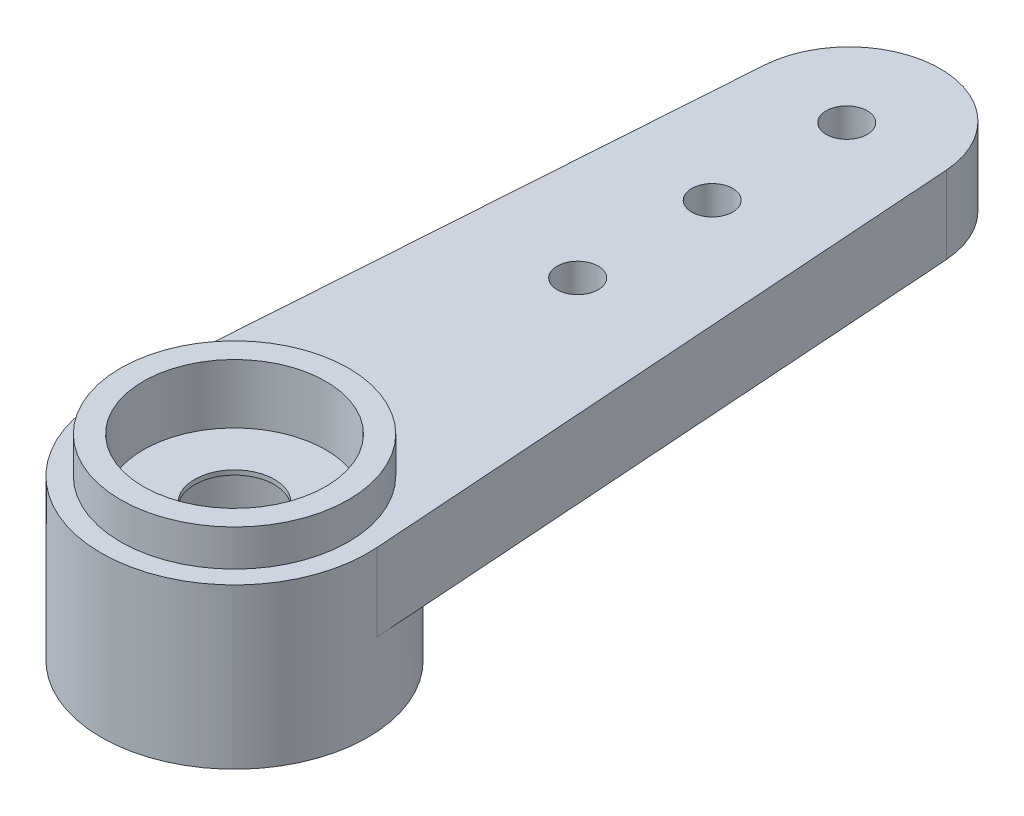
ISO-10303-21;
HEADER;
FILE_DESCRIPTION(('STEP AP214'),'2;1');
FILE_NAME('part.step','',(''),(''),'','','');
FILE_SCHEMA(('AUTOMOTIVE_DESIGN { 1 0 10303 214 1 1 1 1 }'));
ENDSEC;
DATA;
#1=APPLICATION_CONTEXT('core data for automotive mechanical design processes');
#2=APPLICATION_PROTOCOL_DEFINITION('international standard','automotive_design',2000,#1);
#3=PRODUCT_CONTEXT('',#1,'mechanical');
#4=PRODUCT('Part','Part','',(#3));
#5=PRODUCT_RELATED_PRODUCT_CATEGORY('part','',(#4));
#6=PRODUCT_DEFINITION_FORMATION('','',#4);
#7=PRODUCT_DEFINITION_CONTEXT('part definition',#1,'design');
#8=PRODUCT_DEFINITION('design','',#6,#7);
#9=PRODUCT_DEFINITION_SHAPE('','',#8);
#10=(LENGTH_UNIT() NAMED_UNIT(*) SI_UNIT(.MILLI.,.METRE.));
#11=(NAMED_UNIT(*) PLANE_ANGLE_UNIT() SI_UNIT($,.RADIAN.));
#12=(NAMED_UNIT(*) SI_UNIT($,.STERADIAN.) SOLID_ANGLE_UNIT());
#13=UNCERTAINTY_MEASURE_WITH_UNIT(LENGTH_MEASURE(1.E-05),#10,'distance_accuracy_value','');
#14=(GEOMETRIC_REPRESENTATION_CONTEXT(3) GLOBAL_UNCERTAINTY_ASSIGNED_CONTEXT((#13)) GLOBAL_UNIT_ASSIGNED_CONTEXT((#10,
#11,#12)) REPRESENTATION_CONTEXT('',''));
#15=CARTESIAN_POINT('',(0.,0.,0.));
#16=DIRECTION('',(0.,0.,1.));
#17=DIRECTION('',(1.,0.,0.));
#18=AXIS2_PLACEMENT_3D('',#15,#16,#17);
#19=CARTESIAN_POINT('',(0.,0.,0.));
#20=DIRECTION('',(0.,1.,0.));
#21=DIRECTION('',(0.,0.,1.));
#22=AXIS2_PLACEMENT_3D('',#19,#20,#21);
#23=CYLINDRICAL_SURFACE('',#22,0.875);
#24=CARTESIAN_POINT('',(0.,2.9,0.));
#25=DIRECTION('',(0.,-1.,0.));
#26=DIRECTION('',(0.,0.,-1.));
#27=AXIS2_PLACEMENT_3D('',#24,#25,#26);
#28=CIRCLE('',#27,0.875);
#29=CARTESIAN_POINT('',(0.,2.9,0.875));
#30=VERTEX_POINT('',#29);
#31=EDGE_CURVE('E140',#30,#30,#28,.F.);
#32=CARTESIAN_POINT('',(0.,3.,0.));
#33=DIRECTION('',(0.,1.,0.));
#34=DIRECTION('',(0.,0.,1.));
#35=AXIS2_PLACEMENT_3D('',#32,#33,#34);
#36=CIRCLE('',#35,0.875);
#37=CARTESIAN_POINT('',(0.,3.,0.875));
#38=VERTEX_POINT('',#37);
#39=EDGE_CURVE('E50',#38,#38,#36,.F.);
#40=CARTESIAN_POINT('',(0.,2.9,0.875));
#41=CARTESIAN_POINT('',(0.,2.90104166666667,0.875));
#42=CARTESIAN_POINT('',(0.,2.90208333333333,0.875));
#43=CARTESIAN_POINT('',(0.,2.90416666666667,0.875));
#44=CARTESIAN_POINT('',(0.,2.90520833333333,0.875));
#45=CARTESIAN_POINT('',(0.,2.90729166666667,0.875));
#46=CARTESIAN_POINT('',(0.,2.90833333333333,0.875));
#47=CARTESIAN_POINT('',(0.,2.91041666666667,0.875));
#48=CARTESIAN_POINT('',(0.,2.91145833333333,0.875));
#49=CARTESIAN_POINT('',(0.,2.91354166666667,0.875));
#50=CARTESIAN_POINT('',(0.,2.91458333333333,0.875));
#51=CARTESIAN_POINT('',(0.,2.91666666666667,0.875));
#52=CARTESIAN_POINT('',(0.,2.91770833333333,0.875));
#53=CARTESIAN_POINT('',(0.,2.91979166666667,0.875));
#54=CARTESIAN_POINT('',(0.,2.92083333333333,0.875));
#55=CARTESIAN_POINT('',(0.,2.92291666666667,0.875));
#56=CARTESIAN_POINT('',(0.,2.92395833333333,0.875));
#57=CARTESIAN_POINT('',(0.,2.92604166666667,0.875));
#58=CARTESIAN_POINT('',(0.,2.92708333333333,0.875));
#59=CARTESIAN_POINT('',(0.,2.92916666666667,0.875));
#60=CARTESIAN_POINT('',(0.,2.93020833333333,0.875));
#61=CARTESIAN_POINT('',(0.,2.93229166666667,0.875));
#62=CARTESIAN_POINT('',(0.,2.93333333333333,0.875));
#63=CARTESIAN_POINT('',(0.,2.93541666666667,0.875));
#64=CARTESIAN_POINT('',(0.,2.93645833333333,0.875));
#65=CARTESIAN_POINT('',(0.,2.93854166666667,0.875));
#66=CARTESIAN_POINT('',(0.,2.93958333333333,0.875));
#67=CARTESIAN_POINT('',(0.,2.94166666666667,0.875));
#68=CARTESIAN_POINT('',(0.,2.94270833333333,0.875));
#69=CARTESIAN_POINT('',(0.,2.94479166666667,0.875));
#70=CARTESIAN_POINT('',(0.,2.94583333333333,0.875));
#71=CARTESIAN_POINT('',(0.,2.94791666666667,0.875));
#72=CARTESIAN_POINT('',(0.,2.94895833333333,0.875));
#73=CARTESIAN_POINT('',(0.,2.95104166666667,0.875));
#74=CARTESIAN_POINT('',(0.,2.95208333333333,0.875));
#75=CARTESIAN_POINT('',(0.,2.95416666666667,0.875));
#76=CARTESIAN_POINT('',(0.,2.95520833333333,0.875));
#77=CARTESIAN_POINT('',(0.,2.95729166666667,0.875));
#78=CARTESIAN_POINT('',(0.,2.95833333333333,0.875));
#79=CARTESIAN_POINT('',(0.,2.96041666666667,0.875));
#80=CARTESIAN_POINT('',(0.,2.96145833333333,0.875));
#81=CARTESIAN_POINT('',(0.,2.96354166666667,0.875));
#82=CARTESIAN_POINT('',(0.,2.96458333333333,0.875));
#83=CARTESIAN_POINT('',(0.,2.96666666666667,0.875));
#84=CARTESIAN_POINT('',(0.,2.96770833333333,0.875));
#85=CARTESIAN_POINT('',(0.,2.96979166666667,0.875));
#86=CARTESIAN_POINT('',(0.,2.97083333333333,0.875));
#87=CARTESIAN_POINT('',(0.,2.97291666666667,0.875));
#88=CARTESIAN_POINT('',(0.,2.97395833333333,0.875));
#89=CARTESIAN_POINT('',(0.,2.97604166666667,0.875));
#90=CARTESIAN_POINT('',(0.,2.97708333333333,0.875));
#91=CARTESIAN_POINT('',(0.,2.97916666666667,0.875));
#92=CARTESIAN_POINT('',(0.,2.98020833333333,0.875));
#93=CARTESIAN_POINT('',(0.,2.98229166666667,0.875));
#94=CARTESIAN_POINT('',(0.,2.98333333333333,0.875));
#95=CARTESIAN_POINT('',(0.,2.98541666666667,0.875));
#96=CARTESIAN_POINT('',(0.,2.98645833333333,0.875));
#97=CARTESIAN_POINT('',(0.,2.98854166666667,0.875));
#98=CARTESIAN_POINT('',(0.,2.98958333333333,0.875));
#99=CARTESIAN_POINT('',(0.,2.99166666666667,0.875));
#100=CARTESIAN_POINT('',(0.,2.99270833333333,0.875));
#101=CARTESIAN_POINT('',(0.,2.99479166666667,0.875));
#102=CARTESIAN_POINT('',(0.,2.99583333333333,0.875));
#103=CARTESIAN_POINT('',(0.,2.99791666666667,0.875));
#104=CARTESIAN_POINT('',(0.,2.99895833333333,0.875));
#105=CARTESIAN_POINT('',(0.,3.,0.875));
#106=B_SPLINE_CURVE_WITH_KNOTS('',3,(#40,#41,#42,#43,#44,#45,#46,#47,#48,#49,#50,#51,#52,#53,
#54,#55,#56,#57,#58,#59,#60,#61,#62,#63,#64,#65,#66,#67,#68,#69,#70,#71,#72,#73,#74,#75,#76,#77,
#78,#79,#80,#81,#82,#83,#84,#85,#86,#87,#88,#89,#90,#91,#92,#93,#94,#95,#96,#97,#98,#99,#100,
#101,#102,#103,#104,#105),.UNSPECIFIED.,.F.,.F.,(4,2,2,2,2,2,2,2,2,2,2,2,2,2,2,2,2,2,2,2,2,2,2,
2,2,2,2,2,2,2,2,2,4),(0.,0.00312500000000009,0.00625000000000018,0.00937499999999983,
0.0124999999999999,0.015625,0.0187499999999997,0.0218749999999998,0.0249999999999998,
0.0281249999999999,0.03125,0.0343749999999997,0.0374999999999998,0.0406249999999999,
0.0437499999999995,0.0468749999999996,0.0499999999999997,0.0531249999999998,0.0562499999999999,
0.0593749999999995,0.0624999999999996,0.0656249999999997,0.0687499999999994,0.0718749999999995,
0.0749999999999995,0.0781249999999996,0.0812499999999997,0.0843749999999994,0.0874999999999995,
0.0906249999999996,0.0937499999999992,0.0968749999999993,0.0999999999999994),.UNSPECIFIED.);
#107=EDGE_CURVE('BSEAM46',#30,#38,#106,.T.);
#108=ORIENTED_EDGE('',*,*,#31,.F.);
#109=ORIENTED_EDGE('',*,*,#39,.F.);
#110=ORIENTED_EDGE('',*,*,#107,.T.);
#111=ORIENTED_EDGE('',*,*,#107,.F.);
#112=EDGE_LOOP('',(#108,#110,#109,#111));
#113=FACE_BOUND('',#112,.T.);
#114=ADVANCED_FACE('F46',(#113),#23,.F.);
#115=CARTESIAN_POINT('',(0.,0.,0.));
#116=DIRECTION('',(0.,1.,0.));
#117=DIRECTION('',(0.,0.,1.));
#118=AXIS2_PLACEMENT_3D('',#115,#116,#117);
#119=PLANE('',#118);
#120=CARTESIAN_POINT('',(0.,0.,0.));
#121=DIRECTION('',(0.,1.,0.));
#122=DIRECTION('',(0.,0.,1.));
#123=AXIS2_PLACEMENT_3D('',#120,#121,#122);
#124=CIRCLE('',#123,2.925);
#125=CARTESIAN_POINT('',(0.,0.,2.925));
#126=VERTEX_POINT('',#125);
#127=EDGE_CURVE('E55',#126,#126,#124,.T.);
#128=ORIENTED_EDGE('',*,*,#127,.F.);
#129=EDGE_LOOP('',(#128));
#130=FACE_BOUND('',#129,.T.);
#131=CARTESIAN_POINT('',(0.,0.,0.));
#132=DIRECTION('',(0.,1.,0.));
#133=DIRECTION('',(0.,0.,1.));
#134=AXIS2_PLACEMENT_3D('',#131,#132,#133);
#135=CIRCLE('',#134,1.925);
#136=CARTESIAN_POINT('',(0.,0.,1.925));
#137=VERTEX_POINT('',#136);
#138=EDGE_CURVE('E121',#137,#137,#135,.T.);
#139=ORIENTED_EDGE('',*,*,#138,.T.);
#140=EDGE_LOOP('',(#139));
#141=FACE_BOUND('',#140,.T.);
#142=ADVANCED_FACE('F183',(#130,#141),#119,.F.);
#143=CARTESIAN_POINT('',(0.,1.8,0.));
#144=DIRECTION('',(0.,-1.,0.));
#145=DIRECTION('',(0.,0.,-1.));
#146=AXIS2_PLACEMENT_3D('',#143,#144,#145);
#147=CYLINDRICAL_SURFACE('',#146,2.925);
#148=CARTESIAN_POINT('',(0.,1.8,0.));
#149=DIRECTION('',(0.,1.,0.));
#150=DIRECTION('',(0.,0.,1.));
#151=AXIS2_PLACEMENT_3D('',#148,#149,#150);
#152=CIRCLE('',#151,2.925);
#153=CARTESIAN_POINT('',(2.91810023463645,1.8,-0.200788497217068));
#154=VERTEX_POINT('',#153);
#155=CARTESIAN_POINT('',(-2.91810023463645,1.8,-0.200788497217069));
#156=VERTEX_POINT('',#155);
#157=EDGE_CURVE('E13',#154,#156,#152,.T.);
#158=ORIENTED_EDGE('',*,*,#157,.F.);
#159=DIRECTION('',(0.,-1.,0.));
#160=VECTOR('',#159,1.);
#161=CARTESIAN_POINT('',(2.91810023463645,3.5,-0.200788497217068));
#162=LINE('',#161,#160);
#163=CARTESIAN_POINT('',(2.91810023463645,3.5,-0.200788497217068));
#164=VERTEX_POINT('',#163);
#165=EDGE_CURVE('E113',#164,#154,#162,.T.);
#166=ORIENTED_EDGE('',*,*,#165,.F.);
#167=CARTESIAN_POINT('',(0.,3.5,0.));
#168=DIRECTION('',(0.,1.,0.));
#169=DIRECTION('',(0.,0.,1.));
#170=AXIS2_PLACEMENT_3D('',#167,#168,#169);
#171=CIRCLE('',#170,2.925);
#172=CARTESIAN_POINT('',(-2.91810023463645,3.5,-0.200788497217069));
#173=VERTEX_POINT('',#172);
#174=EDGE_CURVE('E70',#173,#164,#171,.T.);
#175=ORIENTED_EDGE('',*,*,#174,.F.);
#176=DIRECTION('',(0.,-1.,0.));
#177=VECTOR('',#176,1.);
#178=CARTESIAN_POINT('',(-2.91810023463645,3.5,-0.200788497217069));
#179=LINE('',#178,#177);
#180=EDGE_CURVE('E109',#173,#156,#179,.T.);
#181=ORIENTED_EDGE('',*,*,#180,.T.);
#182=EDGE_LOOP('',(#158,#166,#175,#181));
#183=FACE_BOUND('',#182,.T.);
#184=ORIENTED_EDGE('',*,*,#127,.T.);
#185=EDGE_LOOP('',(#184));
#186=FACE_BOUND('',#185,.T.);
#187=ADVANCED_FACE('F48',(#183,#186),#147,.T.);
#188=CARTESIAN_POINT('',(0.,1.8,0.));
#189=DIRECTION('',(0.,-1.,0.));
#190=DIRECTION('',(0.,0.,-1.));
#191=AXIS2_PLACEMENT_3D('',#188,#189,#190);
#192=CYLINDRICAL_SURFACE('',#191,1.925);
#193=ORIENTED_EDGE('',*,*,#138,.F.);
#194=EDGE_LOOP('',(#193));
#195=FACE_BOUND('',#194,.T.);
#196=CARTESIAN_POINT('',(0.,2.9,0.));
#197=DIRECTION('',(0.,-1.,0.));
#198=DIRECTION('',(0.,0.,-1.));
#199=AXIS2_PLACEMENT_3D('',#196,#197,#198);
#200=CIRCLE('',#199,1.925);
#201=CARTESIAN_POINT('',(0.,2.9,-1.925));
#202=VERTEX_POINT('',#201);
#203=EDGE_CURVE('E143',#202,#202,#200,.T.);
#204=ORIENTED_EDGE('',*,*,#203,.F.);
#205=EDGE_LOOP('',(#204));
#206=FACE_BOUND('',#205,.T.);
#207=ADVANCED_FACE('F182',(#195,#206),#192,.F.);
#208=CARTESIAN_POINT('',(0.,1.8,0.));
#209=DIRECTION('',(0.,1.,0.));
#210=DIRECTION('',(0.,0.,1.));
#211=AXIS2_PLACEMENT_3D('',#208,#209,#210);
#212=PLANE('',#211);
#213=CARTESIAN_POINT('',(0.,1.8,-7.525));
#214=DIRECTION('',(0.,1.,0.));
#215=DIRECTION('',(0.,0.,1.));
#216=AXIS2_PLACEMENT_3D('',#213,#214,#215);
#217=CIRCLE('',#216,0.45);
#218=CARTESIAN_POINT('',(0.,1.8,-7.075));
#219=VERTEX_POINT('',#218);
#220=EDGE_CURVE('E147',#219,#219,#217,.T.);
#221=ORIENTED_EDGE('',*,*,#220,.T.);
#222=EDGE_LOOP('',(#221));
#223=FACE_BOUND('',#222,.T.);
#224=CARTESIAN_POINT('',(0.,1.8,-10.475));
#225=DIRECTION('',(0.,1.,0.));
#226=DIRECTION('',(0.,0.,1.));
#227=AXIS2_PLACEMENT_3D('',#224,#225,#226);
#228=CIRCLE('',#227,0.450000000000001);
#229=CARTESIAN_POINT('',(0.,1.8,-10.025));
#230=VERTEX_POINT('',#229);
#231=EDGE_CURVE('E162',#230,#230,#228,.T.);
#232=ORIENTED_EDGE('',*,*,#231,.T.);
#233=EDGE_LOOP('',(#232));
#234=FACE_BOUND('',#233,.T.);
#235=CARTESIAN_POINT('',(0.,1.8,-13.425));
#236=DIRECTION('',(0.,1.,0.));
#237=DIRECTION('',(0.,0.,1.));
#238=AXIS2_PLACEMENT_3D('',#235,#236,#237);
#239=CIRCLE('',#238,0.45);
#240=CARTESIAN_POINT('',(0.,1.8,-12.975));
#241=VERTEX_POINT('',#240);
#242=EDGE_CURVE('E168',#241,#241,#239,.T.);
#243=ORIENTED_EDGE('',*,*,#242,.T.);
#244=EDGE_LOOP('',(#243));
#245=FACE_BOUND('',#244,.T.);
#246=DIRECTION('',(0.0686456400742114,0.,0.997641105858616));
#247=VECTOR('',#246,1.);
#248=CARTESIAN_POINT('',(2.91810023463645,1.8,-0.200788497217068));
#249=LINE('',#248,#247);
#250=CARTESIAN_POINT('',(1.99528221171723,1.8,-13.6122912801484));
#251=VERTEX_POINT('',#250);
#252=EDGE_CURVE('E118',#251,#154,#249,.T.);
#253=ORIENTED_EDGE('',*,*,#252,.T.);
#254=ORIENTED_EDGE('',*,*,#157,.T.);
#255=DIRECTION('',(-0.0686456400742115,0.,0.997641105858616));
#256=VECTOR('',#255,1.);
#257=CARTESIAN_POINT('',(-2.91810023463645,1.8,-0.200788497217069));
#258=LINE('',#257,#256);
#259=CARTESIAN_POINT('',(-1.99528221171723,1.8,-13.6122912801484));
#260=VERTEX_POINT('',#259);
#261=EDGE_CURVE('E117',#260,#156,#258,.T.);
#262=ORIENTED_EDGE('',*,*,#261,.F.);
#263=CARTESIAN_POINT('',(0.,1.8,-13.475));
#264=DIRECTION('',(0.,1.,0.));
#265=DIRECTION('',(0.,0.,1.));
#266=AXIS2_PLACEMENT_3D('',#263,#264,#265);
#267=CIRCLE('',#266,2.);
#268=EDGE_CURVE('E107',#251,#260,#267,.T.);
#269=ORIENTED_EDGE('',*,*,#268,.F.);
#270=EDGE_LOOP('',(#253,#254,#262,#269));
#271=FACE_BOUND('',#270,.T.);
#272=ADVANCED_FACE('F179',(#223,#234,#245,#271),#212,.F.);
#273=CARTESIAN_POINT('',(2.91810023463645,3.5,-0.200788497217068));
#274=DIRECTION('',(0.997641105858616,0.,-0.0686456400742114));
#275=DIRECTION('',(-0.0686456400742114,0.,-0.997641105858616));
#276=AXIS2_PLACEMENT_3D('',#273,#274,#275);
#277=PLANE('',#276);
#278=ORIENTED_EDGE('',*,*,#252,.F.);
#279=DIRECTION('',(0.,-1.,0.));
#280=VECTOR('',#279,1.);
#281=CARTESIAN_POINT('',(1.99528221171723,3.5,-13.6122912801484));
#282=LINE('',#281,#280);
#283=CARTESIAN_POINT('',(1.99528221171723,3.5,-13.6122912801484));
#284=VERTEX_POINT('',#283);
#285=EDGE_CURVE('E91',#284,#251,#282,.T.);
#286=ORIENTED_EDGE('',*,*,#285,.F.);
#287=DIRECTION('',(0.0686456400742114,0.,0.997641105858616));
#288=VECTOR('',#287,1.);
#289=CARTESIAN_POINT('',(2.91810023463645,3.5,-0.200788497217068));
#290=LINE('',#289,#288);
#291=EDGE_CURVE('E100',#284,#164,#290,.T.);
#292=ORIENTED_EDGE('',*,*,#291,.T.);
#293=ORIENTED_EDGE('',*,*,#165,.T.);
#294=EDGE_LOOP('',(#278,#286,#292,#293));
#295=FACE_BOUND('',#294,.T.);
#296=ADVANCED_FACE('F178',(#295),#277,.T.);
#297=CARTESIAN_POINT('',(0.,3.5,-13.475));
#298=DIRECTION('',(0.,-1.,0.));
#299=DIRECTION('',(0.,0.,-1.));
#300=AXIS2_PLACEMENT_3D('',#297,#298,#299);
#301=CYLINDRICAL_SURFACE('',#300,2.);
#302=ORIENTED_EDGE('',*,*,#268,.T.);
#303=DIRECTION('',(0.,-1.,0.));
#304=VECTOR('',#303,1.);
#305=CARTESIAN_POINT('',(-1.99528221171723,3.5,-13.6122912801484));
#306=LINE('',#305,#304);
#307=CARTESIAN_POINT('',(-1.99528221171723,3.5,-13.6122912801484));
#308=VERTEX_POINT('',#307);
#309=EDGE_CURVE('E104',#308,#260,#306,.T.);
#310=ORIENTED_EDGE('',*,*,#309,.F.);
#311=CARTESIAN_POINT('',(0.,3.5,-13.475));
#312=DIRECTION('',(0.,1.,0.));
#313=DIRECTION('',(0.,0.,1.));
#314=AXIS2_PLACEMENT_3D('',#311,#312,#313);
#315=CIRCLE('',#314,2.);
#316=EDGE_CURVE('E94',#284,#308,#315,.T.);
#317=ORIENTED_EDGE('',*,*,#316,.F.);
#318=ORIENTED_EDGE('',*,*,#285,.T.);
#319=EDGE_LOOP('',(#302,#310,#317,#318));
#320=FACE_BOUND('',#319,.T.);
#321=ADVANCED_FACE('F105',(#320),#301,.T.);
#322=CARTESIAN_POINT('',(-2.91810023463645,3.5,-0.200788497217069));
#323=DIRECTION('',(0.997641105858616,0.,0.0686456400742115));
#324=DIRECTION('',(0.0686456400742115,0.,-0.997641105858616));
#325=AXIS2_PLACEMENT_3D('',#322,#323,#324);
#326=PLANE('',#325);
#327=ORIENTED_EDGE('',*,*,#261,.T.);
#328=ORIENTED_EDGE('',*,*,#180,.F.);
#329=DIRECTION('',(-0.0686456400742115,0.,0.997641105858616));
#330=VECTOR('',#329,1.);
#331=CARTESIAN_POINT('',(-2.91810023463645,3.5,-0.200788497217069));
#332=LINE('',#331,#330);
#333=EDGE_CURVE('E98',#308,#173,#332,.T.);
#334=ORIENTED_EDGE('',*,*,#333,.F.);
#335=ORIENTED_EDGE('',*,*,#309,.T.);
#336=EDGE_LOOP('',(#327,#328,#334,#335));
#337=FACE_BOUND('',#336,.T.);
#338=ADVANCED_FACE('F111',(#337),#326,.F.);
#339=CARTESIAN_POINT('',(0.,3.5,0.));
#340=DIRECTION('',(0.,1.,0.));
#341=DIRECTION('',(0.,0.,1.));
#342=AXIS2_PLACEMENT_3D('',#339,#340,#341);
#343=PLANE('',#342);
#344=CARTESIAN_POINT('',(0.,3.5,-7.525));
#345=DIRECTION('',(0.,1.,0.));
#346=DIRECTION('',(0.,0.,1.));
#347=AXIS2_PLACEMENT_3D('',#344,#345,#346);
#348=CIRCLE('',#347,0.45);
#349=CARTESIAN_POINT('',(0.,3.5,-7.075));
#350=VERTEX_POINT('',#349);
#351=EDGE_CURVE('E142',#350,#350,#348,.T.);
#352=ORIENTED_EDGE('',*,*,#351,.F.);
#353=EDGE_LOOP('',(#352));
#354=FACE_BOUND('',#353,.T.);
#355=CARTESIAN_POINT('',(0.,3.5,-10.475));
#356=DIRECTION('',(0.,1.,0.));
#357=DIRECTION('',(0.,0.,1.));
#358=AXIS2_PLACEMENT_3D('',#355,#356,#357);
#359=CIRCLE('',#358,0.450000000000001);
#360=CARTESIAN_POINT('',(0.,3.5,-10.025));
#361=VERTEX_POINT('',#360);
#362=EDGE_CURVE('E159',#361,#361,#359,.T.);
#363=ORIENTED_EDGE('',*,*,#362,.F.);
#364=EDGE_LOOP('',(#363));
#365=FACE_BOUND('',#364,.T.);
#366=CARTESIAN_POINT('',(0.,3.5,-13.425));
#367=DIRECTION('',(0.,1.,0.));
#368=DIRECTION('',(0.,0.,1.));
#369=AXIS2_PLACEMENT_3D('',#366,#367,#368);
#370=CIRCLE('',#369,0.45);
#371=CARTESIAN_POINT('',(0.,3.5,-12.975));
#372=VERTEX_POINT('',#371);
#373=EDGE_CURVE('E165',#372,#372,#370,.T.);
#374=ORIENTED_EDGE('',*,*,#373,.F.);
#375=EDGE_LOOP('',(#374));
#376=FACE_BOUND('',#375,.T.);
#377=CARTESIAN_POINT('',(0.,3.5,0.));
#378=DIRECTION('',(0.,1.,0.));
#379=DIRECTION('',(0.,0.,1.));
#380=AXIS2_PLACEMENT_3D('',#377,#378,#379);
#381=CIRCLE('',#380,2.5);
#382=CARTESIAN_POINT('',(0.,3.5,2.5));
#383=VERTEX_POINT('',#382);
#384=EDGE_CURVE('E174',#383,#383,#381,.T.);
#385=ORIENTED_EDGE('',*,*,#384,.F.);
#386=EDGE_LOOP('',(#385));
#387=FACE_BOUND('',#386,.T.);
#388=ORIENTED_EDGE('',*,*,#291,.F.);
#389=ORIENTED_EDGE('',*,*,#316,.T.);
#390=ORIENTED_EDGE('',*,*,#333,.T.);
#391=ORIENTED_EDGE('',*,*,#174,.T.);
#392=EDGE_LOOP('',(#388,#389,#390,#391));
#393=FACE_BOUND('',#392,.T.);
#394=ADVANCED_FACE('F96',(#354,#365,#376,#387,#393),#343,.T.);
#395=CARTESIAN_POINT('',(0.,4.3,0.));
#396=DIRECTION('',(0.,1.,0.));
#397=DIRECTION('',(0.,0.,1.));
#398=AXIS2_PLACEMENT_3D('',#395,#396,#397);
#399=PLANE('',#398);
#400=CARTESIAN_POINT('',(0.,4.3,0.));
#401=DIRECTION('',(0.,1.,0.));
#402=DIRECTION('',(0.,0.,1.));
#403=AXIS2_PLACEMENT_3D('',#400,#401,#402);
#404=CIRCLE('',#403,2.5);
#405=CARTESIAN_POINT('',(0.,4.3,2.5));
#406=VERTEX_POINT('',#405);
#407=EDGE_CURVE('E132',#406,#406,#404,.T.);
#408=ORIENTED_EDGE('',*,*,#407,.T.);
#409=EDGE_LOOP('',(#408));
#410=FACE_BOUND('',#409,.T.);
#411=CARTESIAN_POINT('',(0.,4.3,0.));
#412=DIRECTION('',(0.,1.,0.));
#413=DIRECTION('',(0.,0.,1.));
#414=AXIS2_PLACEMENT_3D('',#411,#412,#413);
#415=CIRCLE('',#414,2.);
#416=CARTESIAN_POINT('',(0.,4.3,2.));
#417=VERTEX_POINT('',#416);
#418=EDGE_CURVE('E171',#417,#417,#415,.T.);
#419=ORIENTED_EDGE('',*,*,#418,.F.);
#420=EDGE_LOOP('',(#419));
#421=FACE_BOUND('',#420,.T.);
#422=ADVANCED_FACE('F226',(#410,#421),#399,.T.);
#423=CARTESIAN_POINT('',(0.,4.3,0.));
#424=DIRECTION('',(0.,-1.,0.));
#425=DIRECTION('',(0.,0.,-1.));
#426=AXIS2_PLACEMENT_3D('',#423,#424,#425);
#427=CYLINDRICAL_SURFACE('',#426,2.5);
#428=ORIENTED_EDGE('',*,*,#407,.F.);
#429=EDGE_LOOP('',(#428));
#430=FACE_BOUND('',#429,.T.);
#431=ORIENTED_EDGE('',*,*,#384,.T.);
#432=EDGE_LOOP('',(#431));
#433=FACE_BOUND('',#432,.T.);
#434=ADVANCED_FACE('F224',(#430,#433),#427,.T.);
#435=CARTESIAN_POINT('',(0.,4.3,0.));
#436=DIRECTION('',(0.,-1.,0.));
#437=DIRECTION('',(0.,0.,-1.));
#438=AXIS2_PLACEMENT_3D('',#435,#436,#437);
#439=CYLINDRICAL_SURFACE('',#438,2.);
#440=ORIENTED_EDGE('',*,*,#418,.T.);
#441=EDGE_LOOP('',(#440));
#442=FACE_BOUND('',#441,.T.);
#443=CARTESIAN_POINT('',(0.,3.,0.));
#444=DIRECTION('',(0.,1.,0.));
#445=DIRECTION('',(0.,0.,1.));
#446=AXIS2_PLACEMENT_3D('',#443,#444,#445);
#447=CIRCLE('',#446,2.);
#448=CARTESIAN_POINT('',(0.,3.,2.));
#449=VERTEX_POINT('',#448);
#450=EDGE_CURVE('E154',#449,#449,#447,.T.);
#451=ORIENTED_EDGE('',*,*,#450,.F.);
#452=EDGE_LOOP('',(#451));
#453=FACE_BOUND('',#452,.T.);
#454=ADVANCED_FACE('F220',(#442,#453),#439,.F.);
#455=CARTESIAN_POINT('',(0.,0.,-13.425));
#456=DIRECTION('',(0.,1.,0.));
#457=DIRECTION('',(0.,0.,1.));
#458=AXIS2_PLACEMENT_3D('',#455,#456,#457);
#459=CYLINDRICAL_SURFACE('',#458,0.45);
#460=ORIENTED_EDGE('',*,*,#373,.T.);
#461=EDGE_LOOP('',(#460));
#462=FACE_BOUND('',#461,.T.);
#463=ORIENTED_EDGE('',*,*,#242,.F.);
#464=EDGE_LOOP('',(#463));
#465=FACE_BOUND('',#464,.T.);
#466=ADVANCED_FACE('F216',(#462,#465),#459,.F.);
#467=CARTESIAN_POINT('',(0.,0.,-10.475));
#468=DIRECTION('',(0.,1.,0.));
#469=DIRECTION('',(0.,0.,1.));
#470=AXIS2_PLACEMENT_3D('',#467,#468,#469);
#471=CYLINDRICAL_SURFACE('',#470,0.450000000000001);
#472=ORIENTED_EDGE('',*,*,#362,.T.);
#473=EDGE_LOOP('',(#472));
#474=FACE_BOUND('',#473,.T.);
#475=ORIENTED_EDGE('',*,*,#231,.F.);
#476=EDGE_LOOP('',(#475));
#477=FACE_BOUND('',#476,.T.);
#478=ADVANCED_FACE('F212',(#474,#477),#471,.F.);
#479=CARTESIAN_POINT('',(0.,0.,-7.525));
#480=DIRECTION('',(0.,1.,0.));
#481=DIRECTION('',(0.,0.,1.));
#482=AXIS2_PLACEMENT_3D('',#479,#480,#481);
#483=CYLINDRICAL_SURFACE('',#482,0.45);
#484=ORIENTED_EDGE('',*,*,#351,.T.);
#485=EDGE_LOOP('',(#484));
#486=FACE_BOUND('',#485,.T.);
#487=ORIENTED_EDGE('',*,*,#220,.F.);
#488=EDGE_LOOP('',(#487));
#489=FACE_BOUND('',#488,.T.);
#490=ADVANCED_FACE('F209',(#486,#489),#483,.F.);
#491=CARTESIAN_POINT('',(0.,2.9,0.));
#492=DIRECTION('',(0.,-1.,0.));
#493=DIRECTION('',(0.,0.,-1.));
#494=AXIS2_PLACEMENT_3D('',#491,#492,#493);
#495=PLANE('',#494);
#496=ORIENTED_EDGE('',*,*,#203,.T.);
#497=EDGE_LOOP('',(#496));
#498=FACE_BOUND('',#497,.T.);
#499=ORIENTED_EDGE('',*,*,#31,.T.);
#500=EDGE_LOOP('',(#499));
#501=FACE_BOUND('',#500,.T.);
#502=ADVANCED_FACE('F207',(#498,#501),#495,.T.);
#503=CARTESIAN_POINT('',(0.,3.,0.));
#504=DIRECTION('',(0.,1.,0.));
#505=DIRECTION('',(0.,0.,1.));
#506=AXIS2_PLACEMENT_3D('',#503,#504,#505);
#507=PLANE('',#506);
#508=ORIENTED_EDGE('',*,*,#450,.T.);
#509=EDGE_LOOP('',(#508));
#510=FACE_BOUND('',#509,.T.);
#511=ORIENTED_EDGE('',*,*,#39,.T.);
#512=EDGE_LOOP('',(#511));
#513=FACE_BOUND('',#512,.T.);
#514=ADVANCED_FACE('F288',(#510,#513),#507,.T.);
#515=CLOSED_SHELL('',(#114,#142,#187,#207,#272,#296,#321,#338,#394,#422,#434,#454,#466,#478,
#490,#502,#514));
#516=MANIFOLD_SOLID_BREP('B2',#515);
#517=ADVANCED_BREP_SHAPE_REPRESENTATION('',(#18,#516),#14);
#518=SHAPE_DEFINITION_REPRESENTATION(#9,#517);
ENDSEC;
END-ISO-10303-21;
